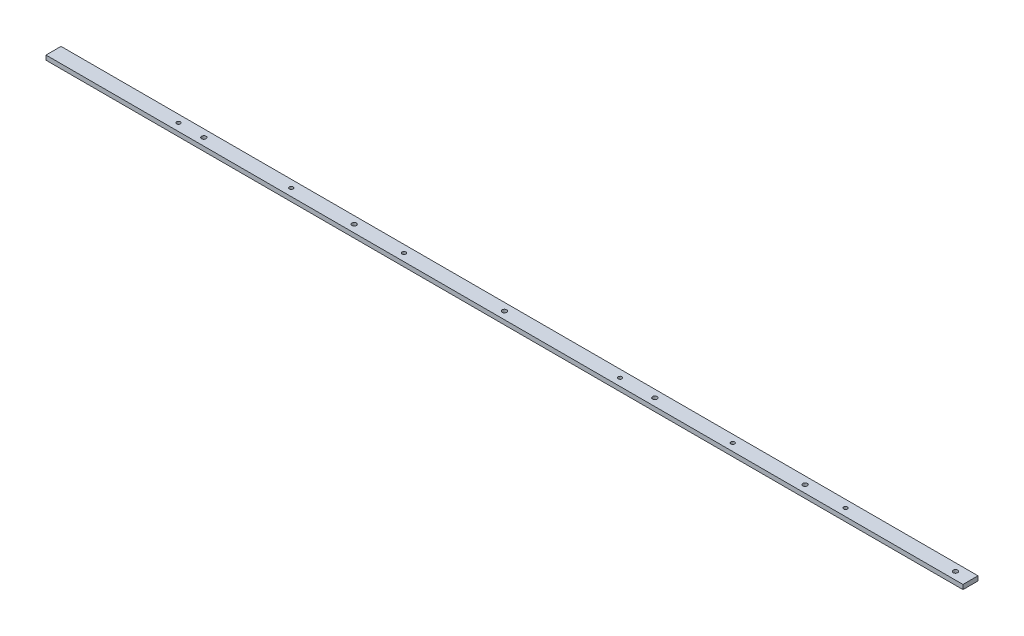
ISO-10303-21;
HEADER;
FILE_DESCRIPTION(('STEP AP214'),'2;1');
FILE_NAME('part.step','',(''),(''),'','','');
FILE_SCHEMA(('AUTOMOTIVE_DESIGN { 1 0 10303 214 1 1 1 1 }'));
ENDSEC;
DATA;
#1=APPLICATION_CONTEXT('core data for automotive mechanical design processes');
#2=APPLICATION_PROTOCOL_DEFINITION('international standard','automotive_design',2000,#1);
#3=PRODUCT_CONTEXT('',#1,'mechanical');
#4=PRODUCT('Part','Part','',(#3));
#5=PRODUCT_RELATED_PRODUCT_CATEGORY('part','',(#4));
#6=PRODUCT_DEFINITION_FORMATION('','',#4);
#7=PRODUCT_DEFINITION_CONTEXT('part definition',#1,'design');
#8=PRODUCT_DEFINITION('design','',#6,#7);
#9=PRODUCT_DEFINITION_SHAPE('','',#8);
#10=(LENGTH_UNIT() NAMED_UNIT(*) SI_UNIT(.MILLI.,.METRE.));
#11=(NAMED_UNIT(*) PLANE_ANGLE_UNIT() SI_UNIT($,.RADIAN.));
#12=(NAMED_UNIT(*) SI_UNIT($,.STERADIAN.) SOLID_ANGLE_UNIT());
#13=UNCERTAINTY_MEASURE_WITH_UNIT(LENGTH_MEASURE(1.E-05),#10,'distance_accuracy_value','');
#14=(GEOMETRIC_REPRESENTATION_CONTEXT(3) GLOBAL_UNCERTAINTY_ASSIGNED_CONTEXT((#13)) GLOBAL_UNIT_ASSIGNED_CONTEXT((#10,
#11,#12)) REPRESENTATION_CONTEXT('',''));
#15=CARTESIAN_POINT('',(0.,0.,0.));
#16=DIRECTION('',(0.,0.,1.));
#17=DIRECTION('',(1.,0.,0.));
#18=AXIS2_PLACEMENT_3D('',#15,#16,#17);
#19=CARTESIAN_POINT('',(1220.,0.,10.));
#20=DIRECTION('',(0.,0.,-1.));
#21=DIRECTION('',(-1.,0.,0.));
#22=AXIS2_PLACEMENT_3D('',#19,#20,#21);
#23=PLANE('',#22);
#24=DIRECTION('',(0.,-1.,0.));
#25=VECTOR('',#24,1.);
#26=CARTESIAN_POINT('',(0.,0.,10.));
#27=LINE('',#26,#25);
#28=CARTESIAN_POINT('',(0.,6.,10.));
#29=VERTEX_POINT('',#28);
#30=CARTESIAN_POINT('',(0.,0.,10.));
#31=VERTEX_POINT('',#30);
#32=EDGE_CURVE('E112',#29,#31,#27,.T.);
#33=ORIENTED_EDGE('',*,*,#32,.T.);
#34=DIRECTION('',(-1.,0.,0.));
#35=VECTOR('',#34,1.);
#36=CARTESIAN_POINT('',(1220.,0.,10.));
#37=LINE('',#36,#35);
#38=CARTESIAN_POINT('',(1220.,0.,10.));
#39=VERTEX_POINT('',#38);
#40=EDGE_CURVE('E11',#39,#31,#37,.T.);
#41=ORIENTED_EDGE('',*,*,#40,.F.);
#42=DIRECTION('',(0.,-1.,0.));
#43=VECTOR('',#42,1.);
#44=CARTESIAN_POINT('',(1220.,0.,10.));
#45=LINE('',#44,#43);
#46=CARTESIAN_POINT('',(1220.,6.,10.));
#47=VERTEX_POINT('',#46);
#48=EDGE_CURVE('E95',#47,#39,#45,.T.);
#49=ORIENTED_EDGE('',*,*,#48,.F.);
#50=DIRECTION('',(-1.,0.,0.));
#51=VECTOR('',#50,1.);
#52=CARTESIAN_POINT('',(1220.,6.,10.));
#53=LINE('',#52,#51);
#54=EDGE_CURVE('E108',#47,#29,#53,.T.);
#55=ORIENTED_EDGE('',*,*,#54,.T.);
#56=EDGE_LOOP('',(#33,#41,#49,#55));
#57=FACE_BOUND('',#56,.T.);
#58=ADVANCED_FACE('F43',(#57),#23,.F.);
#59=CARTESIAN_POINT('',(1220.,0.,10.));
#60=DIRECTION('',(0.,1.,0.));
#61=DIRECTION('',(0.,0.,1.));
#62=AXIS2_PLACEMENT_3D('',#59,#60,#61);
#63=PLANE('',#62);
#64=CARTESIAN_POINT('',(166.25,0.,0.));
#65=DIRECTION('',(0.,1.,0.));
#66=DIRECTION('',(0.,0.,1.));
#67=AXIS2_PLACEMENT_3D('',#64,#65,#66);
#68=CIRCLE('',#67,2.5);
#69=CARTESIAN_POINT('',(166.25,0.,2.5));
#70=VERTEX_POINT('',#69);
#71=EDGE_CURVE('E219',#70,#70,#68,.T.);
#72=ORIENTED_EDGE('',*,*,#71,.T.);
#73=EDGE_LOOP('',(#72));
#74=FACE_BOUND('',#73,.T.);
#75=CARTESIAN_POINT('',(316.25,0.,0.));
#76=DIRECTION('',(0.,1.,0.));
#77=DIRECTION('',(0.,0.,1.));
#78=AXIS2_PLACEMENT_3D('',#75,#76,#77);
#79=CIRCLE('',#78,2.5);
#80=CARTESIAN_POINT('',(316.25,0.,2.5));
#81=VERTEX_POINT('',#80);
#82=EDGE_CURVE('E211',#81,#81,#79,.T.);
#83=ORIENTED_EDGE('',*,*,#82,.T.);
#84=EDGE_LOOP('',(#83));
#85=FACE_BOUND('',#84,.T.);
#86=CARTESIAN_POINT('',(466.25,0.,0.));
#87=DIRECTION('',(0.,1.,0.));
#88=DIRECTION('',(0.,0.,1.));
#89=AXIS2_PLACEMENT_3D('',#86,#87,#88);
#90=CIRCLE('',#89,2.5);
#91=CARTESIAN_POINT('',(466.25,0.,2.5));
#92=VERTEX_POINT('',#91);
#93=EDGE_CURVE('E203',#92,#92,#90,.T.);
#94=ORIENTED_EDGE('',*,*,#93,.T.);
#95=EDGE_LOOP('',(#94));
#96=FACE_BOUND('',#95,.T.);
#97=CARTESIAN_POINT('',(753.75,0.,0.));
#98=DIRECTION('',(0.,1.,0.));
#99=DIRECTION('',(0.,0.,1.));
#100=AXIS2_PLACEMENT_3D('',#97,#98,#99);
#101=CIRCLE('',#100,2.49999999999995);
#102=CARTESIAN_POINT('',(753.75,0.,2.49999999999995));
#103=VERTEX_POINT('',#102);
#104=EDGE_CURVE('E195',#103,#103,#101,.T.);
#105=ORIENTED_EDGE('',*,*,#104,.T.);
#106=EDGE_LOOP('',(#105));
#107=FACE_BOUND('',#106,.T.);
#108=CARTESIAN_POINT('',(903.75,0.,0.));
#109=DIRECTION('',(0.,1.,0.));
#110=DIRECTION('',(0.,0.,1.));
#111=AXIS2_PLACEMENT_3D('',#108,#109,#110);
#112=CIRCLE('',#111,2.49999999999995);
#113=CARTESIAN_POINT('',(903.75,0.,2.49999999999995));
#114=VERTEX_POINT('',#113);
#115=EDGE_CURVE('E187',#114,#114,#112,.T.);
#116=ORIENTED_EDGE('',*,*,#115,.T.);
#117=EDGE_LOOP('',(#116));
#118=FACE_BOUND('',#117,.T.);
#119=CARTESIAN_POINT('',(1053.75,0.,0.));
#120=DIRECTION('',(0.,1.,0.));
#121=DIRECTION('',(0.,0.,1.));
#122=AXIS2_PLACEMENT_3D('',#119,#120,#121);
#123=CIRCLE('',#122,2.49999999999995);
#124=CARTESIAN_POINT('',(1053.75,0.,2.49999999999995));
#125=VERTEX_POINT('',#124);
#126=EDGE_CURVE('E140',#125,#125,#123,.T.);
#127=ORIENTED_EDGE('',*,*,#126,.T.);
#128=EDGE_LOOP('',(#127));
#129=FACE_BOUND('',#128,.T.);
#130=CARTESIAN_POINT('',(200.,0.,0.));
#131=DIRECTION('',(0.,1.,0.));
#132=DIRECTION('',(0.,0.,1.));
#133=AXIS2_PLACEMENT_3D('',#130,#131,#132);
#134=CIRCLE('',#133,2.99999999999999);
#135=CARTESIAN_POINT('',(200.,0.,2.99999999999999));
#136=VERTEX_POINT('',#135);
#137=EDGE_CURVE('E116',#136,#136,#134,.T.);
#138=ORIENTED_EDGE('',*,*,#137,.T.);
#139=EDGE_LOOP('',(#138));
#140=FACE_BOUND('',#139,.T.);
#141=CARTESIAN_POINT('',(400.,0.,0.));
#142=DIRECTION('',(0.,1.,0.));
#143=DIRECTION('',(0.,0.,1.));
#144=AXIS2_PLACEMENT_3D('',#141,#142,#143);
#145=CIRCLE('',#144,2.99999999999999);
#146=CARTESIAN_POINT('',(400.,0.,2.99999999999999));
#147=VERTEX_POINT('',#146);
#148=EDGE_CURVE('E169',#147,#147,#145,.T.);
#149=ORIENTED_EDGE('',*,*,#148,.T.);
#150=EDGE_LOOP('',(#149));
#151=FACE_BOUND('',#150,.T.);
#152=CARTESIAN_POINT('',(600.,0.,0.));
#153=DIRECTION('',(0.,1.,0.));
#154=DIRECTION('',(0.,0.,1.));
#155=AXIS2_PLACEMENT_3D('',#152,#153,#154);
#156=CIRCLE('',#155,3.00000000000005);
#157=CARTESIAN_POINT('',(600.,0.,3.00000000000005));
#158=VERTEX_POINT('',#157);
#159=EDGE_CURVE('E162',#158,#158,#156,.T.);
#160=ORIENTED_EDGE('',*,*,#159,.T.);
#161=EDGE_LOOP('',(#160));
#162=FACE_BOUND('',#161,.T.);
#163=CARTESIAN_POINT('',(800.,0.,0.));
#164=DIRECTION('',(0.,1.,0.));
#165=DIRECTION('',(0.,0.,1.));
#166=AXIS2_PLACEMENT_3D('',#163,#164,#165);
#167=CIRCLE('',#166,3.00000000000005);
#168=CARTESIAN_POINT('',(800.,0.,3.00000000000005));
#169=VERTEX_POINT('',#168);
#170=EDGE_CURVE('E155',#169,#169,#167,.T.);
#171=ORIENTED_EDGE('',*,*,#170,.T.);
#172=EDGE_LOOP('',(#171));
#173=FACE_BOUND('',#172,.T.);
#174=CARTESIAN_POINT('',(1000.,0.,0.));
#175=DIRECTION('',(0.,1.,0.));
#176=DIRECTION('',(0.,0.,1.));
#177=AXIS2_PLACEMENT_3D('',#174,#175,#176);
#178=CIRCLE('',#177,2.99999999999993);
#179=CARTESIAN_POINT('',(1000.,0.,2.99999999999993));
#180=VERTEX_POINT('',#179);
#181=EDGE_CURVE('E147',#180,#180,#178,.T.);
#182=ORIENTED_EDGE('',*,*,#181,.T.);
#183=EDGE_LOOP('',(#182));
#184=FACE_BOUND('',#183,.T.);
#185=CARTESIAN_POINT('',(1200.,0.,0.));
#186=DIRECTION('',(0.,1.,0.));
#187=DIRECTION('',(0.,0.,1.));
#188=AXIS2_PLACEMENT_3D('',#185,#186,#187);
#189=CIRCLE('',#188,2.99999999999993);
#190=CARTESIAN_POINT('',(1200.,0.,2.99999999999993));
#191=VERTEX_POINT('',#190);
#192=EDGE_CURVE('E139',#191,#191,#189,.T.);
#193=ORIENTED_EDGE('',*,*,#192,.T.);
#194=EDGE_LOOP('',(#193));
#195=FACE_BOUND('',#194,.T.);
#196=DIRECTION('',(0.,0.,-1.));
#197=VECTOR('',#196,1.);
#198=CARTESIAN_POINT('',(0.,0.,10.));
#199=LINE('',#198,#197);
#200=CARTESIAN_POINT('',(0.,0.,-10.));
#201=VERTEX_POINT('',#200);
#202=EDGE_CURVE('E100',#31,#201,#199,.T.);
#203=ORIENTED_EDGE('',*,*,#202,.T.);
#204=DIRECTION('',(-1.,0.,0.));
#205=VECTOR('',#204,1.);
#206=CARTESIAN_POINT('',(1220.,0.,-10.));
#207=LINE('',#206,#205);
#208=CARTESIAN_POINT('',(1220.,0.,-10.));
#209=VERTEX_POINT('',#208);
#210=EDGE_CURVE('E52',#209,#201,#207,.T.);
#211=ORIENTED_EDGE('',*,*,#210,.F.);
#212=DIRECTION('',(0.,0.,-1.));
#213=VECTOR('',#212,1.);
#214=CARTESIAN_POINT('',(1220.,0.,10.));
#215=LINE('',#214,#213);
#216=EDGE_CURVE('E90',#39,#209,#215,.T.);
#217=ORIENTED_EDGE('',*,*,#216,.F.);
#218=ORIENTED_EDGE('',*,*,#40,.T.);
#219=EDGE_LOOP('',(#203,#211,#217,#218));
#220=FACE_BOUND('',#219,.T.);
#221=ADVANCED_FACE('F99',(#74,#85,#96,#107,#118,#129,#140,#151,#162,#173,#184,#195,#220),#63,.F.);
#222=CARTESIAN_POINT('',(1220.,0.,-10.));
#223=DIRECTION('',(0.,0.,1.));
#224=DIRECTION('',(1.,0.,0.));
#225=AXIS2_PLACEMENT_3D('',#222,#223,#224);
#226=PLANE('',#225);
#227=DIRECTION('',(0.,1.,0.));
#228=VECTOR('',#227,1.);
#229=CARTESIAN_POINT('',(0.,0.,-10.));
#230=LINE('',#229,#228);
#231=CARTESIAN_POINT('',(0.,6.,-10.));
#232=VERTEX_POINT('',#231);
#233=EDGE_CURVE('E77',#201,#232,#230,.T.);
#234=ORIENTED_EDGE('',*,*,#233,.T.);
#235=DIRECTION('',(-1.,0.,0.));
#236=VECTOR('',#235,1.);
#237=CARTESIAN_POINT('',(1220.,6.,-10.));
#238=LINE('',#237,#236);
#239=CARTESIAN_POINT('',(1220.,6.,-10.));
#240=VERTEX_POINT('',#239);
#241=EDGE_CURVE('E102',#240,#232,#238,.T.);
#242=ORIENTED_EDGE('',*,*,#241,.F.);
#243=DIRECTION('',(0.,1.,0.));
#244=VECTOR('',#243,1.);
#245=CARTESIAN_POINT('',(1220.,0.,-10.));
#246=LINE('',#245,#244);
#247=EDGE_CURVE('E93',#209,#240,#246,.T.);
#248=ORIENTED_EDGE('',*,*,#247,.F.);
#249=ORIENTED_EDGE('',*,*,#210,.T.);
#250=EDGE_LOOP('',(#234,#242,#248,#249));
#251=FACE_BOUND('',#250,.T.);
#252=ADVANCED_FACE('F103',(#251),#226,.F.);
#253=CARTESIAN_POINT('',(1220.,6.,10.));
#254=DIRECTION('',(0.,-1.,0.));
#255=DIRECTION('',(0.,0.,-1.));
#256=AXIS2_PLACEMENT_3D('',#253,#254,#255);
#257=PLANE('',#256);
#258=CARTESIAN_POINT('',(166.25,6.,0.));
#259=DIRECTION('',(0.,1.,0.));
#260=DIRECTION('',(0.,0.,1.));
#261=AXIS2_PLACEMENT_3D('',#258,#259,#260);
#262=CIRCLE('',#261,2.5);
#263=CARTESIAN_POINT('',(166.25,6.,2.5));
#264=VERTEX_POINT('',#263);
#265=EDGE_CURVE('E223',#264,#264,#262,.T.);
#266=ORIENTED_EDGE('',*,*,#265,.F.);
#267=EDGE_LOOP('',(#266));
#268=FACE_BOUND('',#267,.T.);
#269=CARTESIAN_POINT('',(316.25,6.,0.));
#270=DIRECTION('',(0.,1.,0.));
#271=DIRECTION('',(0.,0.,1.));
#272=AXIS2_PLACEMENT_3D('',#269,#270,#271);
#273=CIRCLE('',#272,2.5);
#274=CARTESIAN_POINT('',(316.25,6.,2.5));
#275=VERTEX_POINT('',#274);
#276=EDGE_CURVE('E215',#275,#275,#273,.T.);
#277=ORIENTED_EDGE('',*,*,#276,.F.);
#278=EDGE_LOOP('',(#277));
#279=FACE_BOUND('',#278,.T.);
#280=CARTESIAN_POINT('',(466.25,6.,0.));
#281=DIRECTION('',(0.,1.,0.));
#282=DIRECTION('',(0.,0.,1.));
#283=AXIS2_PLACEMENT_3D('',#280,#281,#282);
#284=CIRCLE('',#283,2.5);
#285=CARTESIAN_POINT('',(466.25,6.,2.5));
#286=VERTEX_POINT('',#285);
#287=EDGE_CURVE('E207',#286,#286,#284,.T.);
#288=ORIENTED_EDGE('',*,*,#287,.F.);
#289=EDGE_LOOP('',(#288));
#290=FACE_BOUND('',#289,.T.);
#291=CARTESIAN_POINT('',(753.75,6.,0.));
#292=DIRECTION('',(0.,1.,0.));
#293=DIRECTION('',(0.,0.,1.));
#294=AXIS2_PLACEMENT_3D('',#291,#292,#293);
#295=CIRCLE('',#294,2.49999999999995);
#296=CARTESIAN_POINT('',(753.75,6.,2.49999999999995));
#297=VERTEX_POINT('',#296);
#298=EDGE_CURVE('E199',#297,#297,#295,.T.);
#299=ORIENTED_EDGE('',*,*,#298,.F.);
#300=EDGE_LOOP('',(#299));
#301=FACE_BOUND('',#300,.T.);
#302=CARTESIAN_POINT('',(903.75,6.,0.));
#303=DIRECTION('',(0.,1.,0.));
#304=DIRECTION('',(0.,0.,1.));
#305=AXIS2_PLACEMENT_3D('',#302,#303,#304);
#306=CIRCLE('',#305,2.49999999999995);
#307=CARTESIAN_POINT('',(903.75,6.,2.49999999999995));
#308=VERTEX_POINT('',#307);
#309=EDGE_CURVE('E191',#308,#308,#306,.T.);
#310=ORIENTED_EDGE('',*,*,#309,.F.);
#311=EDGE_LOOP('',(#310));
#312=FACE_BOUND('',#311,.T.);
#313=CARTESIAN_POINT('',(1053.75,6.,0.));
#314=DIRECTION('',(0.,1.,0.));
#315=DIRECTION('',(0.,0.,1.));
#316=AXIS2_PLACEMENT_3D('',#313,#314,#315);
#317=CIRCLE('',#316,2.49999999999995);
#318=CARTESIAN_POINT('',(1053.75,6.,2.49999999999995));
#319=VERTEX_POINT('',#318);
#320=EDGE_CURVE('E183',#319,#319,#317,.T.);
#321=ORIENTED_EDGE('',*,*,#320,.F.);
#322=EDGE_LOOP('',(#321));
#323=FACE_BOUND('',#322,.T.);
#324=CARTESIAN_POINT('',(200.,6.,0.));
#325=DIRECTION('',(0.,1.,0.));
#326=DIRECTION('',(0.,0.,1.));
#327=AXIS2_PLACEMENT_3D('',#324,#325,#326);
#328=CIRCLE('',#327,2.99999999999999);
#329=CARTESIAN_POINT('',(200.,6.,2.99999999999999));
#330=VERTEX_POINT('',#329);
#331=EDGE_CURVE('E173',#330,#330,#328,.T.);
#332=ORIENTED_EDGE('',*,*,#331,.F.);
#333=EDGE_LOOP('',(#332));
#334=FACE_BOUND('',#333,.T.);
#335=CARTESIAN_POINT('',(400.,6.,0.));
#336=DIRECTION('',(0.,1.,0.));
#337=DIRECTION('',(0.,0.,1.));
#338=AXIS2_PLACEMENT_3D('',#335,#336,#337);
#339=CIRCLE('',#338,2.99999999999999);
#340=CARTESIAN_POINT('',(400.,6.,2.99999999999999));
#341=VERTEX_POINT('',#340);
#342=EDGE_CURVE('E166',#341,#341,#339,.T.);
#343=ORIENTED_EDGE('',*,*,#342,.F.);
#344=EDGE_LOOP('',(#343));
#345=FACE_BOUND('',#344,.T.);
#346=CARTESIAN_POINT('',(600.,6.,0.));
#347=DIRECTION('',(0.,1.,0.));
#348=DIRECTION('',(0.,0.,1.));
#349=AXIS2_PLACEMENT_3D('',#346,#347,#348);
#350=CIRCLE('',#349,3.00000000000005);
#351=CARTESIAN_POINT('',(600.,6.,3.00000000000005));
#352=VERTEX_POINT('',#351);
#353=EDGE_CURVE('E159',#352,#352,#350,.T.);
#354=ORIENTED_EDGE('',*,*,#353,.F.);
#355=EDGE_LOOP('',(#354));
#356=FACE_BOUND('',#355,.T.);
#357=CARTESIAN_POINT('',(800.,6.,0.));
#358=DIRECTION('',(0.,1.,0.));
#359=DIRECTION('',(0.,0.,1.));
#360=AXIS2_PLACEMENT_3D('',#357,#358,#359);
#361=CIRCLE('',#360,3.00000000000005);
#362=CARTESIAN_POINT('',(800.,6.,3.00000000000005));
#363=VERTEX_POINT('',#362);
#364=EDGE_CURVE('E151',#363,#363,#361,.T.);
#365=ORIENTED_EDGE('',*,*,#364,.F.);
#366=EDGE_LOOP('',(#365));
#367=FACE_BOUND('',#366,.T.);
#368=CARTESIAN_POINT('',(1000.,6.,0.));
#369=DIRECTION('',(0.,1.,0.));
#370=DIRECTION('',(0.,0.,1.));
#371=AXIS2_PLACEMENT_3D('',#368,#369,#370);
#372=CIRCLE('',#371,2.99999999999993);
#373=CARTESIAN_POINT('',(1000.,6.,2.99999999999993));
#374=VERTEX_POINT('',#373);
#375=EDGE_CURVE('E144',#374,#374,#372,.T.);
#376=ORIENTED_EDGE('',*,*,#375,.F.);
#377=EDGE_LOOP('',(#376));
#378=FACE_BOUND('',#377,.T.);
#379=CARTESIAN_POINT('',(1200.,6.,0.));
#380=DIRECTION('',(0.,1.,0.));
#381=DIRECTION('',(0.,0.,1.));
#382=AXIS2_PLACEMENT_3D('',#379,#380,#381);
#383=CIRCLE('',#382,2.99999999999993);
#384=CARTESIAN_POINT('',(1200.,6.,2.99999999999993));
#385=VERTEX_POINT('',#384);
#386=EDGE_CURVE('E135',#385,#385,#383,.T.);
#387=ORIENTED_EDGE('',*,*,#386,.F.);
#388=EDGE_LOOP('',(#387));
#389=FACE_BOUND('',#388,.T.);
#390=DIRECTION('',(0.,0.,1.));
#391=VECTOR('',#390,1.);
#392=CARTESIAN_POINT('',(0.,6.,10.));
#393=LINE('',#392,#391);
#394=EDGE_CURVE('E83',#232,#29,#393,.T.);
#395=ORIENTED_EDGE('',*,*,#394,.T.);
#396=ORIENTED_EDGE('',*,*,#54,.F.);
#397=DIRECTION('',(0.,0.,1.));
#398=VECTOR('',#397,1.);
#399=CARTESIAN_POINT('',(1220.,6.,10.));
#400=LINE('',#399,#398);
#401=EDGE_CURVE('E60',#240,#47,#400,.T.);
#402=ORIENTED_EDGE('',*,*,#401,.F.);
#403=ORIENTED_EDGE('',*,*,#241,.T.);
#404=EDGE_LOOP('',(#395,#396,#402,#403));
#405=FACE_BOUND('',#404,.T.);
#406=ADVANCED_FACE('F127',(#268,#279,#290,#301,#312,#323,#334,#345,#356,#367,#378,#389,#405),
#257,.F.);
#407=CARTESIAN_POINT('',(1220.,0.,0.));
#408=DIRECTION('',(-1.,0.,0.));
#409=DIRECTION('',(0.,0.,1.));
#410=AXIS2_PLACEMENT_3D('',#407,#408,#409);
#411=PLANE('',#410);
#412=ORIENTED_EDGE('',*,*,#48,.T.);
#413=ORIENTED_EDGE('',*,*,#216,.T.);
#414=ORIENTED_EDGE('',*,*,#247,.T.);
#415=ORIENTED_EDGE('',*,*,#401,.T.);
#416=EDGE_LOOP('',(#412,#413,#414,#415));
#417=FACE_BOUND('',#416,.T.);
#418=ADVANCED_FACE('F91',(#417),#411,.F.);
#419=CARTESIAN_POINT('',(0.,0.,0.));
#420=DIRECTION('',(-1.,0.,0.));
#421=DIRECTION('',(0.,0.,1.));
#422=AXIS2_PLACEMENT_3D('',#419,#420,#421);
#423=PLANE('',#422);
#424=ORIENTED_EDGE('',*,*,#32,.F.);
#425=ORIENTED_EDGE('',*,*,#394,.F.);
#426=ORIENTED_EDGE('',*,*,#233,.F.);
#427=ORIENTED_EDGE('',*,*,#202,.F.);
#428=EDGE_LOOP('',(#424,#425,#426,#427));
#429=FACE_BOUND('',#428,.T.);
#430=ADVANCED_FACE('F130',(#429),#423,.T.);
#431=CARTESIAN_POINT('',(1200.,0.,0.));
#432=DIRECTION('',(0.,1.,0.));
#433=DIRECTION('',(0.,0.,1.));
#434=AXIS2_PLACEMENT_3D('',#431,#432,#433);
#435=CYLINDRICAL_SURFACE('',#434,2.99999999999993);
#436=ORIENTED_EDGE('',*,*,#192,.F.);
#437=EDGE_LOOP('',(#436));
#438=FACE_BOUND('',#437,.T.);
#439=ORIENTED_EDGE('',*,*,#386,.T.);
#440=EDGE_LOOP('',(#439));
#441=FACE_BOUND('',#440,.T.);
#442=ADVANCED_FACE('F255',(#438,#441),#435,.F.);
#443=CARTESIAN_POINT('',(1000.,0.,0.));
#444=DIRECTION('',(0.,1.,0.));
#445=DIRECTION('',(0.,0.,1.));
#446=AXIS2_PLACEMENT_3D('',#443,#444,#445);
#447=CYLINDRICAL_SURFACE('',#446,2.99999999999993);
#448=ORIENTED_EDGE('',*,*,#181,.F.);
#449=EDGE_LOOP('',(#448));
#450=FACE_BOUND('',#449,.T.);
#451=ORIENTED_EDGE('',*,*,#375,.T.);
#452=EDGE_LOOP('',(#451));
#453=FACE_BOUND('',#452,.T.);
#454=ADVANCED_FACE('F257',(#450,#453),#447,.F.);
#455=CARTESIAN_POINT('',(800.,0.,0.));
#456=DIRECTION('',(0.,1.,0.));
#457=DIRECTION('',(0.,0.,1.));
#458=AXIS2_PLACEMENT_3D('',#455,#456,#457);
#459=CYLINDRICAL_SURFACE('',#458,3.00000000000005);
#460=ORIENTED_EDGE('',*,*,#170,.F.);
#461=EDGE_LOOP('',(#460));
#462=FACE_BOUND('',#461,.T.);
#463=ORIENTED_EDGE('',*,*,#364,.T.);
#464=EDGE_LOOP('',(#463));
#465=FACE_BOUND('',#464,.T.);
#466=ADVANCED_FACE('F264',(#462,#465),#459,.F.);
#467=CARTESIAN_POINT('',(600.,0.,0.));
#468=DIRECTION('',(0.,1.,0.));
#469=DIRECTION('',(0.,0.,1.));
#470=AXIS2_PLACEMENT_3D('',#467,#468,#469);
#471=CYLINDRICAL_SURFACE('',#470,3.00000000000005);
#472=ORIENTED_EDGE('',*,*,#159,.F.);
#473=EDGE_LOOP('',(#472));
#474=FACE_BOUND('',#473,.T.);
#475=ORIENTED_EDGE('',*,*,#353,.T.);
#476=EDGE_LOOP('',(#475));
#477=FACE_BOUND('',#476,.T.);
#478=ADVANCED_FACE('F303',(#474,#477),#471,.F.);
#479=CARTESIAN_POINT('',(400.,0.,0.));
#480=DIRECTION('',(0.,1.,0.));
#481=DIRECTION('',(0.,0.,1.));
#482=AXIS2_PLACEMENT_3D('',#479,#480,#481);
#483=CYLINDRICAL_SURFACE('',#482,2.99999999999999);
#484=ORIENTED_EDGE('',*,*,#148,.F.);
#485=EDGE_LOOP('',(#484));
#486=FACE_BOUND('',#485,.T.);
#487=ORIENTED_EDGE('',*,*,#342,.T.);
#488=EDGE_LOOP('',(#487));
#489=FACE_BOUND('',#488,.T.);
#490=ADVANCED_FACE('F312',(#486,#489),#483,.F.);
#491=CARTESIAN_POINT('',(200.,0.,0.));
#492=DIRECTION('',(0.,1.,0.));
#493=DIRECTION('',(0.,0.,1.));
#494=AXIS2_PLACEMENT_3D('',#491,#492,#493);
#495=CYLINDRICAL_SURFACE('',#494,2.99999999999999);
#496=ORIENTED_EDGE('',*,*,#137,.F.);
#497=EDGE_LOOP('',(#496));
#498=FACE_BOUND('',#497,.T.);
#499=ORIENTED_EDGE('',*,*,#331,.T.);
#500=EDGE_LOOP('',(#499));
#501=FACE_BOUND('',#500,.T.);
#502=ADVANCED_FACE('F321',(#498,#501),#495,.F.);
#503=CARTESIAN_POINT('',(1053.75,6.,0.));
#504=DIRECTION('',(0.,1.,0.));
#505=DIRECTION('',(0.,0.,1.));
#506=AXIS2_PLACEMENT_3D('',#503,#504,#505);
#507=CYLINDRICAL_SURFACE('',#506,2.49999999999995);
#508=ORIENTED_EDGE('',*,*,#126,.F.);
#509=EDGE_LOOP('',(#508));
#510=FACE_BOUND('',#509,.T.);
#511=ORIENTED_EDGE('',*,*,#320,.T.);
#512=EDGE_LOOP('',(#511));
#513=FACE_BOUND('',#512,.T.);
#514=ADVANCED_FACE('F330',(#510,#513),#507,.F.);
#515=CARTESIAN_POINT('',(903.75,6.,0.));
#516=DIRECTION('',(0.,1.,0.));
#517=DIRECTION('',(0.,0.,1.));
#518=AXIS2_PLACEMENT_3D('',#515,#516,#517);
#519=CYLINDRICAL_SURFACE('',#518,2.49999999999995);
#520=ORIENTED_EDGE('',*,*,#115,.F.);
#521=EDGE_LOOP('',(#520));
#522=FACE_BOUND('',#521,.T.);
#523=ORIENTED_EDGE('',*,*,#309,.T.);
#524=EDGE_LOOP('',(#523));
#525=FACE_BOUND('',#524,.T.);
#526=ADVANCED_FACE('F340',(#522,#525),#519,.F.);
#527=CARTESIAN_POINT('',(753.75,6.,0.));
#528=DIRECTION('',(0.,1.,0.));
#529=DIRECTION('',(0.,0.,1.));
#530=AXIS2_PLACEMENT_3D('',#527,#528,#529);
#531=CYLINDRICAL_SURFACE('',#530,2.49999999999995);
#532=ORIENTED_EDGE('',*,*,#104,.F.);
#533=EDGE_LOOP('',(#532));
#534=FACE_BOUND('',#533,.T.);
#535=ORIENTED_EDGE('',*,*,#298,.T.);
#536=EDGE_LOOP('',(#535));
#537=FACE_BOUND('',#536,.T.);
#538=ADVANCED_FACE('F350',(#534,#537),#531,.F.);
#539=CARTESIAN_POINT('',(466.25,6.,0.));
#540=DIRECTION('',(0.,1.,0.));
#541=DIRECTION('',(0.,0.,1.));
#542=AXIS2_PLACEMENT_3D('',#539,#540,#541);
#543=CYLINDRICAL_SURFACE('',#542,2.5);
#544=ORIENTED_EDGE('',*,*,#93,.F.);
#545=EDGE_LOOP('',(#544));
#546=FACE_BOUND('',#545,.T.);
#547=ORIENTED_EDGE('',*,*,#287,.T.);
#548=EDGE_LOOP('',(#547));
#549=FACE_BOUND('',#548,.T.);
#550=ADVANCED_FACE('F360',(#546,#549),#543,.F.);
#551=CARTESIAN_POINT('',(316.25,6.,0.));
#552=DIRECTION('',(0.,1.,0.));
#553=DIRECTION('',(0.,0.,1.));
#554=AXIS2_PLACEMENT_3D('',#551,#552,#553);
#555=CYLINDRICAL_SURFACE('',#554,2.5);
#556=ORIENTED_EDGE('',*,*,#82,.F.);
#557=EDGE_LOOP('',(#556));
#558=FACE_BOUND('',#557,.T.);
#559=ORIENTED_EDGE('',*,*,#276,.T.);
#560=EDGE_LOOP('',(#559));
#561=FACE_BOUND('',#560,.T.);
#562=ADVANCED_FACE('F370',(#558,#561),#555,.F.);
#563=CARTESIAN_POINT('',(166.25,6.,0.));
#564=DIRECTION('',(0.,1.,0.));
#565=DIRECTION('',(0.,0.,1.));
#566=AXIS2_PLACEMENT_3D('',#563,#564,#565);
#567=CYLINDRICAL_SURFACE('',#566,2.5);
#568=ORIENTED_EDGE('',*,*,#71,.F.);
#569=EDGE_LOOP('',(#568));
#570=FACE_BOUND('',#569,.T.);
#571=ORIENTED_EDGE('',*,*,#265,.T.);
#572=EDGE_LOOP('',(#571));
#573=FACE_BOUND('',#572,.T.);
#574=ADVANCED_FACE('F228',(#570,#573),#567,.F.);
#575=CLOSED_SHELL('',(#58,#221,#252,#406,#418,#430,#442,#454,#466,#478,#490,#502,#514,#526,#538,
#550,#562,#574));
#576=MANIFOLD_SOLID_BREP('B2',#575);
#577=ADVANCED_BREP_SHAPE_REPRESENTATION('',(#18,#576),#14);
#578=SHAPE_DEFINITION_REPRESENTATION(#9,#577);
ENDSEC;
END-ISO-10303-21;
